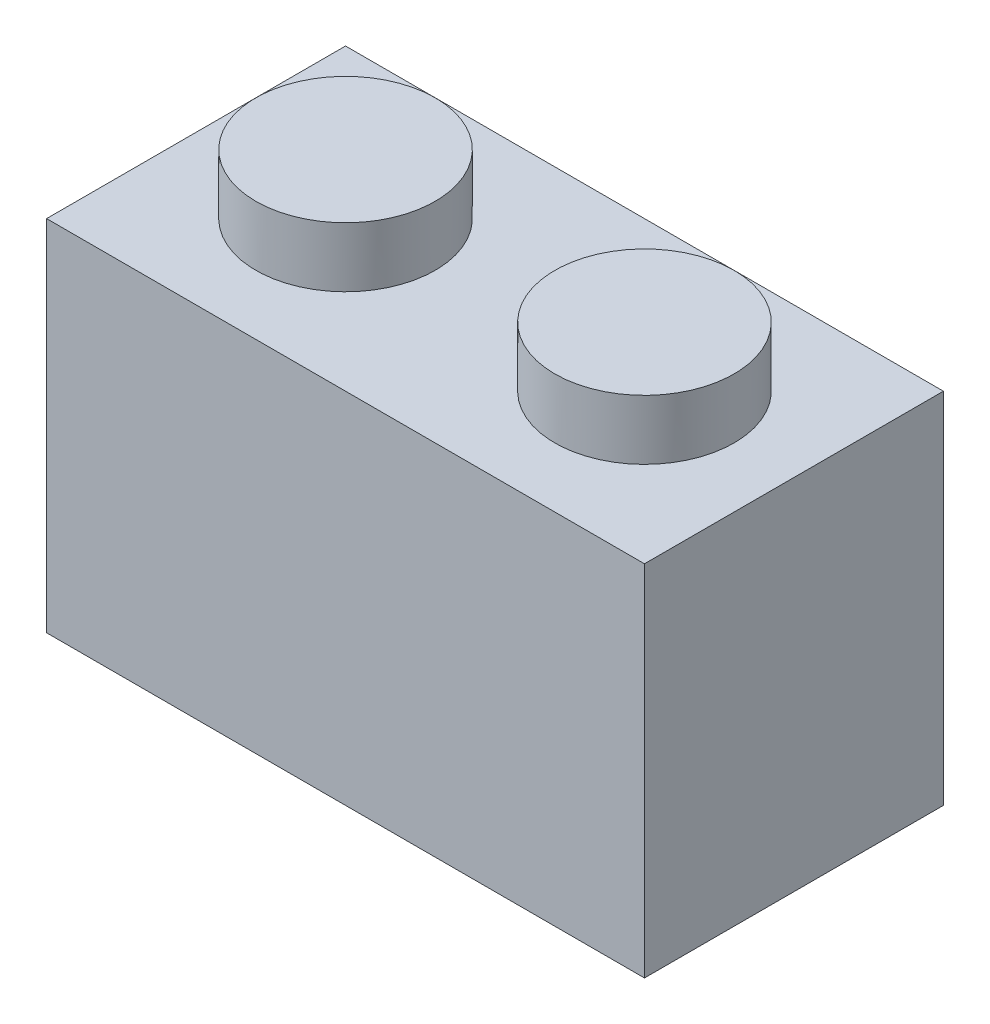
ISO-10303-21;
HEADER;
FILE_DESCRIPTION(('STEP AP214'),'2;1');
FILE_NAME('part.step','',(''),(''),'','','');
FILE_SCHEMA(('AUTOMOTIVE_DESIGN { 1 0 10303 214 1 1 1 1 }'));
ENDSEC;
DATA;
#1=APPLICATION_CONTEXT('core data for automotive mechanical design processes');
#2=APPLICATION_PROTOCOL_DEFINITION('international standard','automotive_design',2000,#1);
#3=PRODUCT_CONTEXT('',#1,'mechanical');
#4=PRODUCT('Part','Part','',(#3));
#5=PRODUCT_RELATED_PRODUCT_CATEGORY('part','',(#4));
#6=PRODUCT_DEFINITION_FORMATION('','',#4);
#7=PRODUCT_DEFINITION_CONTEXT('part definition',#1,'design');
#8=PRODUCT_DEFINITION('design','',#6,#7);
#9=PRODUCT_DEFINITION_SHAPE('','',#8);
#10=(LENGTH_UNIT() NAMED_UNIT(*) SI_UNIT(.MILLI.,.METRE.));
#11=(NAMED_UNIT(*) PLANE_ANGLE_UNIT() SI_UNIT($,.RADIAN.));
#12=(NAMED_UNIT(*) SI_UNIT($,.STERADIAN.) SOLID_ANGLE_UNIT());
#13=UNCERTAINTY_MEASURE_WITH_UNIT(LENGTH_MEASURE(1.E-05),#10,'distance_accuracy_value','');
#14=(GEOMETRIC_REPRESENTATION_CONTEXT(3) GLOBAL_UNCERTAINTY_ASSIGNED_CONTEXT((#13)) GLOBAL_UNIT_ASSIGNED_CONTEXT((#10,
#11,#12)) REPRESENTATION_CONTEXT('',''));
#15=CARTESIAN_POINT('',(0.,0.,0.));
#16=DIRECTION('',(0.,0.,1.));
#17=DIRECTION('',(1.,0.,0.));
#18=AXIS2_PLACEMENT_3D('',#15,#16,#17);
#19=CARTESIAN_POINT('',(0.,0.,0.));
#20=DIRECTION('',(0.,-1.,0.));
#21=DIRECTION('',(0.,0.,-1.));
#22=AXIS2_PLACEMENT_3D('',#19,#20,#21);
#23=PLANE('',#22);
#24=DIRECTION('',(0.,0.,1.));
#25=VECTOR('',#24,1.);
#26=CARTESIAN_POINT('',(0.,0.,0.));
#27=LINE('',#26,#25);
#28=CARTESIAN_POINT('',(0.,0.,-8.));
#29=VERTEX_POINT('',#28);
#30=CARTESIAN_POINT('',(0.,0.,0.));
#31=VERTEX_POINT('',#30);
#32=EDGE_CURVE('E190',#29,#31,#27,.T.);
#33=ORIENTED_EDGE('',*,*,#32,.F.);
#34=DIRECTION('',(-1.,0.,0.));
#35=VECTOR('',#34,1.);
#36=CARTESIAN_POINT('',(0.,0.,-8.));
#37=LINE('',#36,#35);
#38=CARTESIAN_POINT('',(16.,0.,-8.));
#39=VERTEX_POINT('',#38);
#40=EDGE_CURVE('E85',#39,#29,#37,.T.);
#41=ORIENTED_EDGE('',*,*,#40,.F.);
#42=DIRECTION('',(0.,0.,-1.));
#43=VECTOR('',#42,1.);
#44=CARTESIAN_POINT('',(16.,0.,0.));
#45=LINE('',#44,#43);
#46=CARTESIAN_POINT('',(16.,0.,0.));
#47=VERTEX_POINT('',#46);
#48=EDGE_CURVE('E208',#47,#39,#45,.T.);
#49=ORIENTED_EDGE('',*,*,#48,.F.);
#50=DIRECTION('',(1.,0.,0.));
#51=VECTOR('',#50,1.);
#52=CARTESIAN_POINT('',(0.,0.,0.));
#53=LINE('',#52,#51);
#54=EDGE_CURVE('E205',#31,#47,#53,.T.);
#55=ORIENTED_EDGE('',*,*,#54,.F.);
#56=EDGE_LOOP('',(#33,#41,#49,#55));
#57=FACE_BOUND('',#56,.T.);
#58=DIRECTION('',(-1.,0.,0.));
#59=VECTOR('',#58,1.);
#60=CARTESIAN_POINT('',(0.,0.,-6.4));
#61=LINE('',#60,#59);
#62=CARTESIAN_POINT('',(14.4,0.,-6.4));
#63=VERTEX_POINT('',#62);
#64=CARTESIAN_POINT('',(1.6,0.,-6.4));
#65=VERTEX_POINT('',#64);
#66=EDGE_CURVE('E135',#63,#65,#61,.T.);
#67=ORIENTED_EDGE('',*,*,#66,.T.);
#68=DIRECTION('',(0.,0.,1.));
#69=VECTOR('',#68,1.);
#70=CARTESIAN_POINT('',(1.6,0.,0.));
#71=LINE('',#70,#69);
#72=CARTESIAN_POINT('',(1.6,0.,-1.6));
#73=VERTEX_POINT('',#72);
#74=EDGE_CURVE('E169',#65,#73,#71,.T.);
#75=ORIENTED_EDGE('',*,*,#74,.T.);
#76=DIRECTION('',(1.,0.,0.));
#77=VECTOR('',#76,1.);
#78=CARTESIAN_POINT('',(0.,0.,-1.6));
#79=LINE('',#78,#77);
#80=CARTESIAN_POINT('',(14.4,0.,-1.6));
#81=VERTEX_POINT('',#80);
#82=EDGE_CURVE('E139',#73,#81,#79,.T.);
#83=ORIENTED_EDGE('',*,*,#82,.T.);
#84=DIRECTION('',(0.,0.,-1.));
#85=VECTOR('',#84,1.);
#86=CARTESIAN_POINT('',(14.4,0.,0.));
#87=LINE('',#86,#85);
#88=EDGE_CURVE('E55',#81,#63,#87,.T.);
#89=ORIENTED_EDGE('',*,*,#88,.T.);
#90=EDGE_LOOP('',(#67,#75,#83,#89));
#91=FACE_BOUND('',#90,.T.);
#92=ADVANCED_FACE('F39',(#57,#91),#23,.T.);
#93=CARTESIAN_POINT('',(0.,9.6,0.));
#94=DIRECTION('',(1.,0.,0.));
#95=DIRECTION('',(0.,0.,-1.));
#96=AXIS2_PLACEMENT_3D('',#93,#94,#95);
#97=PLANE('',#96);
#98=ORIENTED_EDGE('',*,*,#32,.T.);
#99=DIRECTION('',(0.,-1.,0.));
#100=VECTOR('',#99,1.);
#101=CARTESIAN_POINT('',(0.,9.6,0.));
#102=LINE('',#101,#100);
#103=CARTESIAN_POINT('',(0.,9.6,0.));
#104=VERTEX_POINT('',#103);
#105=EDGE_CURVE('E222',#104,#31,#102,.T.);
#106=ORIENTED_EDGE('',*,*,#105,.F.);
#107=DIRECTION('',(0.,0.,1.));
#108=VECTOR('',#107,1.);
#109=CARTESIAN_POINT('',(0.,9.6,0.));
#110=LINE('',#109,#108);
#111=CARTESIAN_POINT('',(0.,9.6,-8.));
#112=VERTEX_POINT('',#111);
#113=EDGE_CURVE('E191',#112,#104,#110,.T.);
#114=ORIENTED_EDGE('',*,*,#113,.F.);
#115=DIRECTION('',(0.,-1.,0.));
#116=VECTOR('',#115,1.);
#117=CARTESIAN_POINT('',(0.,9.6,-8.));
#118=LINE('',#117,#116);
#119=EDGE_CURVE('E201',#112,#29,#118,.T.);
#120=ORIENTED_EDGE('',*,*,#119,.T.);
#121=EDGE_LOOP('',(#98,#106,#114,#120));
#122=FACE_BOUND('',#121,.T.);
#123=ADVANCED_FACE('F41',(#122),#97,.F.);
#124=CARTESIAN_POINT('',(0.,9.6,0.));
#125=DIRECTION('',(0.,0.,-1.));
#126=DIRECTION('',(-1.,0.,0.));
#127=AXIS2_PLACEMENT_3D('',#124,#125,#126);
#128=PLANE('',#127);
#129=ORIENTED_EDGE('',*,*,#54,.T.);
#130=DIRECTION('',(0.,-1.,0.));
#131=VECTOR('',#130,1.);
#132=CARTESIAN_POINT('',(16.,9.6,0.));
#133=LINE('',#132,#131);
#134=CARTESIAN_POINT('',(16.,9.6,0.));
#135=VERTEX_POINT('',#134);
#136=EDGE_CURVE('E218',#135,#47,#133,.T.);
#137=ORIENTED_EDGE('',*,*,#136,.F.);
#138=DIRECTION('',(1.,0.,0.));
#139=VECTOR('',#138,1.);
#140=CARTESIAN_POINT('',(0.,9.6,0.));
#141=LINE('',#140,#139);
#142=EDGE_CURVE('E93',#104,#135,#141,.T.);
#143=ORIENTED_EDGE('',*,*,#142,.F.);
#144=ORIENTED_EDGE('',*,*,#105,.T.);
#145=EDGE_LOOP('',(#129,#137,#143,#144));
#146=FACE_BOUND('',#145,.T.);
#147=ADVANCED_FACE('F239',(#146),#128,.F.);
#148=CARTESIAN_POINT('',(16.,9.6,0.));
#149=DIRECTION('',(-1.,0.,0.));
#150=DIRECTION('',(0.,0.,1.));
#151=AXIS2_PLACEMENT_3D('',#148,#149,#150);
#152=PLANE('',#151);
#153=ORIENTED_EDGE('',*,*,#48,.T.);
#154=DIRECTION('',(0.,-1.,0.));
#155=VECTOR('',#154,1.);
#156=CARTESIAN_POINT('',(16.,9.6,-8.));
#157=LINE('',#156,#155);
#158=CARTESIAN_POINT('',(16.,9.6,-8.));
#159=VERTEX_POINT('',#158);
#160=EDGE_CURVE('E215',#159,#39,#157,.T.);
#161=ORIENTED_EDGE('',*,*,#160,.F.);
#162=DIRECTION('',(0.,0.,-1.));
#163=VECTOR('',#162,1.);
#164=CARTESIAN_POINT('',(16.,9.6,0.));
#165=LINE('',#164,#163);
#166=EDGE_CURVE('E196',#135,#159,#165,.T.);
#167=ORIENTED_EDGE('',*,*,#166,.F.);
#168=ORIENTED_EDGE('',*,*,#136,.T.);
#169=EDGE_LOOP('',(#153,#161,#167,#168));
#170=FACE_BOUND('',#169,.T.);
#171=ADVANCED_FACE('F244',(#170),#152,.F.);
#172=CARTESIAN_POINT('',(0.,9.6,-8.));
#173=DIRECTION('',(0.,0.,1.));
#174=DIRECTION('',(1.,0.,0.));
#175=AXIS2_PLACEMENT_3D('',#172,#173,#174);
#176=PLANE('',#175);
#177=ORIENTED_EDGE('',*,*,#40,.T.);
#178=ORIENTED_EDGE('',*,*,#119,.F.);
#179=DIRECTION('',(-1.,0.,0.));
#180=VECTOR('',#179,1.);
#181=CARTESIAN_POINT('',(0.,9.6,-8.));
#182=LINE('',#181,#180);
#183=EDGE_CURVE('E64',#159,#112,#182,.T.);
#184=ORIENTED_EDGE('',*,*,#183,.F.);
#185=ORIENTED_EDGE('',*,*,#160,.T.);
#186=EDGE_LOOP('',(#177,#178,#184,#185));
#187=FACE_BOUND('',#186,.T.);
#188=ADVANCED_FACE('F232',(#187),#176,.F.);
#189=CARTESIAN_POINT('',(0.,9.6,0.));
#190=DIRECTION('',(0.,-1.,0.));
#191=DIRECTION('',(0.,0.,-1.));
#192=AXIS2_PLACEMENT_3D('',#189,#190,#191);
#193=PLANE('',#192);
#194=CARTESIAN_POINT('',(4.,9.6,-4.));
#195=DIRECTION('',(0.,-1.,0.));
#196=DIRECTION('',(0.,0.,-1.));
#197=AXIS2_PLACEMENT_3D('',#194,#195,#196);
#198=CIRCLE('',#197,2.4);
#199=CARTESIAN_POINT('',(4.,9.6,-6.4));
#200=VERTEX_POINT('',#199);
#201=EDGE_CURVE('E11',#200,#200,#198,.F.);
#202=ORIENTED_EDGE('',*,*,#201,.F.);
#203=EDGE_LOOP('',(#202));
#204=FACE_BOUND('',#203,.T.);
#205=CARTESIAN_POINT('',(12.,9.6,-4.));
#206=DIRECTION('',(0.,-1.,0.));
#207=DIRECTION('',(0.,0.,-1.));
#208=AXIS2_PLACEMENT_3D('',#205,#206,#207);
#209=CIRCLE('',#208,2.4);
#210=CARTESIAN_POINT('',(12.,9.6,-6.4));
#211=VERTEX_POINT('',#210);
#212=EDGE_CURVE('E48',#211,#211,#209,.F.);
#213=ORIENTED_EDGE('',*,*,#212,.F.);
#214=EDGE_LOOP('',(#213));
#215=FACE_BOUND('',#214,.T.);
#216=ORIENTED_EDGE('',*,*,#113,.T.);
#217=ORIENTED_EDGE('',*,*,#142,.T.);
#218=ORIENTED_EDGE('',*,*,#166,.T.);
#219=ORIENTED_EDGE('',*,*,#183,.T.);
#220=EDGE_LOOP('',(#216,#217,#218,#219));
#221=FACE_BOUND('',#220,.T.);
#222=ADVANCED_FACE('F230',(#204,#215,#221),#193,.F.);
#223=CARTESIAN_POINT('',(12.,11.2,-4.));
#224=DIRECTION('',(0.,-1.,0.));
#225=DIRECTION('',(0.,0.,-1.));
#226=AXIS2_PLACEMENT_3D('',#223,#224,#225);
#227=CYLINDRICAL_SURFACE('',#226,2.4);
#228=CARTESIAN_POINT('',(12.,11.2,-4.));
#229=DIRECTION('',(0.,1.,0.));
#230=DIRECTION('',(0.,0.,1.));
#231=AXIS2_PLACEMENT_3D('',#228,#229,#230);
#232=CIRCLE('',#231,2.4);
#233=CARTESIAN_POINT('',(12.,11.2,-1.6));
#234=VERTEX_POINT('',#233);
#235=EDGE_CURVE('E186',#234,#234,#232,.T.);
#236=ORIENTED_EDGE('',*,*,#235,.F.);
#237=EDGE_LOOP('',(#236));
#238=FACE_BOUND('',#237,.T.);
#239=ORIENTED_EDGE('',*,*,#212,.T.);
#240=EDGE_LOOP('',(#239));
#241=FACE_BOUND('',#240,.T.);
#242=ADVANCED_FACE('F228',(#238,#241),#227,.T.);
#243=CARTESIAN_POINT('',(12.,11.2,-4.));
#244=DIRECTION('',(0.,1.,0.));
#245=DIRECTION('',(0.,0.,1.));
#246=AXIS2_PLACEMENT_3D('',#243,#244,#245);
#247=PLANE('',#246);
#248=ORIENTED_EDGE('',*,*,#235,.T.);
#249=EDGE_LOOP('',(#248));
#250=FACE_BOUND('',#249,.T.);
#251=ADVANCED_FACE('F290',(#250),#247,.T.);
#252=CARTESIAN_POINT('',(4.,11.2,-4.));
#253=DIRECTION('',(0.,-1.,0.));
#254=DIRECTION('',(0.,0.,-1.));
#255=AXIS2_PLACEMENT_3D('',#252,#253,#254);
#256=CYLINDRICAL_SURFACE('',#255,2.4);
#257=CARTESIAN_POINT('',(4.,11.2,-4.));
#258=DIRECTION('',(0.,1.,0.));
#259=DIRECTION('',(0.,0.,1.));
#260=AXIS2_PLACEMENT_3D('',#257,#258,#259);
#261=CIRCLE('',#260,2.4);
#262=CARTESIAN_POINT('',(4.,11.2,-1.6));
#263=VERTEX_POINT('',#262);
#264=EDGE_CURVE('E163',#263,#263,#261,.T.);
#265=ORIENTED_EDGE('',*,*,#264,.F.);
#266=EDGE_LOOP('',(#265));
#267=FACE_BOUND('',#266,.T.);
#268=ORIENTED_EDGE('',*,*,#201,.T.);
#269=EDGE_LOOP('',(#268));
#270=FACE_BOUND('',#269,.T.);
#271=ADVANCED_FACE('F286',(#267,#270),#256,.T.);
#272=CARTESIAN_POINT('',(4.,11.2,-4.));
#273=DIRECTION('',(0.,1.,0.));
#274=DIRECTION('',(0.,0.,1.));
#275=AXIS2_PLACEMENT_3D('',#272,#273,#274);
#276=PLANE('',#275);
#277=ORIENTED_EDGE('',*,*,#264,.T.);
#278=EDGE_LOOP('',(#277));
#279=FACE_BOUND('',#278,.T.);
#280=ADVANCED_FACE('F283',(#279),#276,.T.);
#281=CARTESIAN_POINT('',(1.6,9.6,0.));
#282=DIRECTION('',(1.,0.,0.));
#283=DIRECTION('',(0.,0.,-1.));
#284=AXIS2_PLACEMENT_3D('',#281,#282,#283);
#285=PLANE('',#284);
#286=ORIENTED_EDGE('',*,*,#74,.F.);
#287=DIRECTION('',(0.,-1.,0.));
#288=VECTOR('',#287,1.);
#289=CARTESIAN_POINT('',(1.6,9.6,-6.4));
#290=LINE('',#289,#288);
#291=CARTESIAN_POINT('',(1.6,8.,-6.4));
#292=VERTEX_POINT('',#291);
#293=EDGE_CURVE('E133',#292,#65,#290,.T.);
#294=ORIENTED_EDGE('',*,*,#293,.F.);
#295=DIRECTION('',(0.,0.,1.));
#296=VECTOR('',#295,1.);
#297=CARTESIAN_POINT('',(1.6,8.,0.));
#298=LINE('',#297,#296);
#299=CARTESIAN_POINT('',(1.6,8.,-1.6));
#300=VERTEX_POINT('',#299);
#301=EDGE_CURVE('E120',#292,#300,#298,.T.);
#302=ORIENTED_EDGE('',*,*,#301,.T.);
#303=DIRECTION('',(0.,-1.,0.));
#304=VECTOR('',#303,1.);
#305=CARTESIAN_POINT('',(1.6,9.6,-1.6));
#306=LINE('',#305,#304);
#307=EDGE_CURVE('E131',#300,#73,#306,.T.);
#308=ORIENTED_EDGE('',*,*,#307,.T.);
#309=EDGE_LOOP('',(#286,#294,#302,#308));
#310=FACE_BOUND('',#309,.T.);
#311=ADVANCED_FACE('F130',(#310),#285,.T.);
#312=CARTESIAN_POINT('',(0.,9.6,-1.6));
#313=DIRECTION('',(0.,0.,-1.));
#314=DIRECTION('',(-1.,0.,0.));
#315=AXIS2_PLACEMENT_3D('',#312,#313,#314);
#316=PLANE('',#315);
#317=ORIENTED_EDGE('',*,*,#82,.F.);
#318=ORIENTED_EDGE('',*,*,#307,.F.);
#319=DIRECTION('',(1.,0.,0.));
#320=VECTOR('',#319,1.);
#321=CARTESIAN_POINT('',(0.,8.,-1.6));
#322=LINE('',#321,#320);
#323=CARTESIAN_POINT('',(14.4,8.,-1.6));
#324=VERTEX_POINT('',#323);
#325=EDGE_CURVE('E116',#300,#324,#322,.T.);
#326=ORIENTED_EDGE('',*,*,#325,.T.);
#327=DIRECTION('',(0.,-1.,0.));
#328=VECTOR('',#327,1.);
#329=CARTESIAN_POINT('',(14.4,9.6,-1.6));
#330=LINE('',#329,#328);
#331=EDGE_CURVE('E142',#324,#81,#330,.T.);
#332=ORIENTED_EDGE('',*,*,#331,.T.);
#333=EDGE_LOOP('',(#317,#318,#326,#332));
#334=FACE_BOUND('',#333,.T.);
#335=ADVANCED_FACE('F137',(#334),#316,.T.);
#336=CARTESIAN_POINT('',(14.4,9.6,0.));
#337=DIRECTION('',(-1.,0.,0.));
#338=DIRECTION('',(0.,0.,1.));
#339=AXIS2_PLACEMENT_3D('',#336,#337,#338);
#340=PLANE('',#339);
#341=ORIENTED_EDGE('',*,*,#88,.F.);
#342=ORIENTED_EDGE('',*,*,#331,.F.);
#343=DIRECTION('',(0.,0.,-1.));
#344=VECTOR('',#343,1.);
#345=CARTESIAN_POINT('',(14.4,8.,0.));
#346=LINE('',#345,#344);
#347=CARTESIAN_POINT('',(14.4,8.,-6.4));
#348=VERTEX_POINT('',#347);
#349=EDGE_CURVE('E121',#324,#348,#346,.T.);
#350=ORIENTED_EDGE('',*,*,#349,.T.);
#351=DIRECTION('',(0.,-1.,0.));
#352=VECTOR('',#351,1.);
#353=CARTESIAN_POINT('',(14.4,9.6,-6.4));
#354=LINE('',#353,#352);
#355=EDGE_CURVE('E149',#348,#63,#354,.T.);
#356=ORIENTED_EDGE('',*,*,#355,.T.);
#357=EDGE_LOOP('',(#341,#342,#350,#356));
#358=FACE_BOUND('',#357,.T.);
#359=ADVANCED_FACE('F253',(#358),#340,.T.);
#360=CARTESIAN_POINT('',(0.,9.6,-6.4));
#361=DIRECTION('',(0.,0.,1.));
#362=DIRECTION('',(1.,0.,0.));
#363=AXIS2_PLACEMENT_3D('',#360,#361,#362);
#364=PLANE('',#363);
#365=ORIENTED_EDGE('',*,*,#66,.F.);
#366=ORIENTED_EDGE('',*,*,#355,.F.);
#367=DIRECTION('',(-1.,0.,0.));
#368=VECTOR('',#367,1.);
#369=CARTESIAN_POINT('',(0.,8.,-6.4));
#370=LINE('',#369,#368);
#371=EDGE_CURVE('E153',#348,#292,#370,.T.);
#372=ORIENTED_EDGE('',*,*,#371,.T.);
#373=ORIENTED_EDGE('',*,*,#293,.T.);
#374=EDGE_LOOP('',(#365,#366,#372,#373));
#375=FACE_BOUND('',#374,.T.);
#376=ADVANCED_FACE('F252',(#375),#364,.T.);
#377=CARTESIAN_POINT('',(0.,8.,0.));
#378=DIRECTION('',(0.,-1.,0.));
#379=DIRECTION('',(0.,0.,-1.));
#380=AXIS2_PLACEMENT_3D('',#377,#378,#379);
#381=PLANE('',#380);
#382=CARTESIAN_POINT('',(4.,8.,-4.));
#383=DIRECTION('',(0.,-1.,0.));
#384=DIRECTION('',(0.,0.,-1.));
#385=AXIS2_PLACEMENT_3D('',#382,#383,#384);
#386=CIRCLE('',#385,0.799999999999999);
#387=CARTESIAN_POINT('',(4.,8.,-4.8));
#388=VERTEX_POINT('',#387);
#389=EDGE_CURVE('E147',#388,#388,#386,.F.);
#390=ORIENTED_EDGE('',*,*,#389,.T.);
#391=EDGE_LOOP('',(#390));
#392=FACE_BOUND('',#391,.T.);
#393=CARTESIAN_POINT('',(12.,8.,-4.));
#394=DIRECTION('',(0.,-1.,0.));
#395=DIRECTION('',(0.,0.,-1.));
#396=AXIS2_PLACEMENT_3D('',#393,#394,#395);
#397=CIRCLE('',#396,0.799999999999999);
#398=CARTESIAN_POINT('',(12.,8.,-4.8));
#399=VERTEX_POINT('',#398);
#400=EDGE_CURVE('E141',#399,#399,#397,.F.);
#401=ORIENTED_EDGE('',*,*,#400,.T.);
#402=EDGE_LOOP('',(#401));
#403=FACE_BOUND('',#402,.T.);
#404=ORIENTED_EDGE('',*,*,#301,.F.);
#405=ORIENTED_EDGE('',*,*,#371,.F.);
#406=ORIENTED_EDGE('',*,*,#349,.F.);
#407=ORIENTED_EDGE('',*,*,#325,.F.);
#408=EDGE_LOOP('',(#404,#405,#406,#407));
#409=FACE_BOUND('',#408,.T.);
#410=ADVANCED_FACE('F118',(#392,#403,#409),#381,.T.);
#411=CARTESIAN_POINT('',(12.,11.2,-4.));
#412=DIRECTION('',(0.,-1.,0.));
#413=DIRECTION('',(0.,0.,-1.));
#414=AXIS2_PLACEMENT_3D('',#411,#412,#413);
#415=CYLINDRICAL_SURFACE('',#414,0.799999999999999);
#416=CARTESIAN_POINT('',(12.,9.6,-4.));
#417=DIRECTION('',(0.,1.,0.));
#418=DIRECTION('',(0.,0.,1.));
#419=AXIS2_PLACEMENT_3D('',#416,#417,#418);
#420=CIRCLE('',#419,0.799999999999999);
#421=CARTESIAN_POINT('',(12.,9.6,-3.2));
#422=VERTEX_POINT('',#421);
#423=EDGE_CURVE('E165',#422,#422,#420,.T.);
#424=ORIENTED_EDGE('',*,*,#423,.T.);
#425=EDGE_LOOP('',(#424));
#426=FACE_BOUND('',#425,.T.);
#427=ORIENTED_EDGE('',*,*,#400,.F.);
#428=EDGE_LOOP('',(#427));
#429=FACE_BOUND('',#428,.T.);
#430=ADVANCED_FACE('F266',(#426,#429),#415,.F.);
#431=CARTESIAN_POINT('',(12.,9.6,-4.));
#432=DIRECTION('',(0.,1.,0.));
#433=DIRECTION('',(0.,0.,1.));
#434=AXIS2_PLACEMENT_3D('',#431,#432,#433);
#435=PLANE('',#434);
#436=ORIENTED_EDGE('',*,*,#423,.F.);
#437=EDGE_LOOP('',(#436));
#438=FACE_BOUND('',#437,.T.);
#439=ADVANCED_FACE('F270',(#438),#435,.F.);
#440=CARTESIAN_POINT('',(4.,11.2,-4.));
#441=DIRECTION('',(0.,-1.,0.));
#442=DIRECTION('',(0.,0.,-1.));
#443=AXIS2_PLACEMENT_3D('',#440,#441,#442);
#444=CYLINDRICAL_SURFACE('',#443,0.799999999999999);
#445=CARTESIAN_POINT('',(4.,9.6,-4.));
#446=DIRECTION('',(0.,1.,0.));
#447=DIRECTION('',(0.,0.,1.));
#448=AXIS2_PLACEMENT_3D('',#445,#446,#447);
#449=CIRCLE('',#448,0.799999999999999);
#450=CARTESIAN_POINT('',(4.,9.6,-3.2));
#451=VERTEX_POINT('',#450);
#452=EDGE_CURVE('E170',#451,#451,#449,.T.);
#453=ORIENTED_EDGE('',*,*,#452,.T.);
#454=EDGE_LOOP('',(#453));
#455=FACE_BOUND('',#454,.T.);
#456=ORIENTED_EDGE('',*,*,#389,.F.);
#457=EDGE_LOOP('',(#456));
#458=FACE_BOUND('',#457,.T.);
#459=ADVANCED_FACE('F274',(#455,#458),#444,.F.);
#460=CARTESIAN_POINT('',(4.,9.6,-4.));
#461=DIRECTION('',(0.,1.,0.));
#462=DIRECTION('',(0.,0.,1.));
#463=AXIS2_PLACEMENT_3D('',#460,#461,#462);
#464=PLANE('',#463);
#465=ORIENTED_EDGE('',*,*,#452,.F.);
#466=EDGE_LOOP('',(#465));
#467=FACE_BOUND('',#466,.T.);
#468=ADVANCED_FACE('F278',(#467),#464,.F.);
#469=CLOSED_SHELL('',(#92,#123,#147,#171,#188,#222,#242,#251,#271,#280,#311,#335,#359,#376,#410,
#430,#439,#459,#468));
#470=MANIFOLD_SOLID_BREP('B2',#469);
#471=ADVANCED_BREP_SHAPE_REPRESENTATION('',(#18,#470),#14);
#472=SHAPE_DEFINITION_REPRESENTATION(#9,#471);
ENDSEC;
END-ISO-10303-21;
